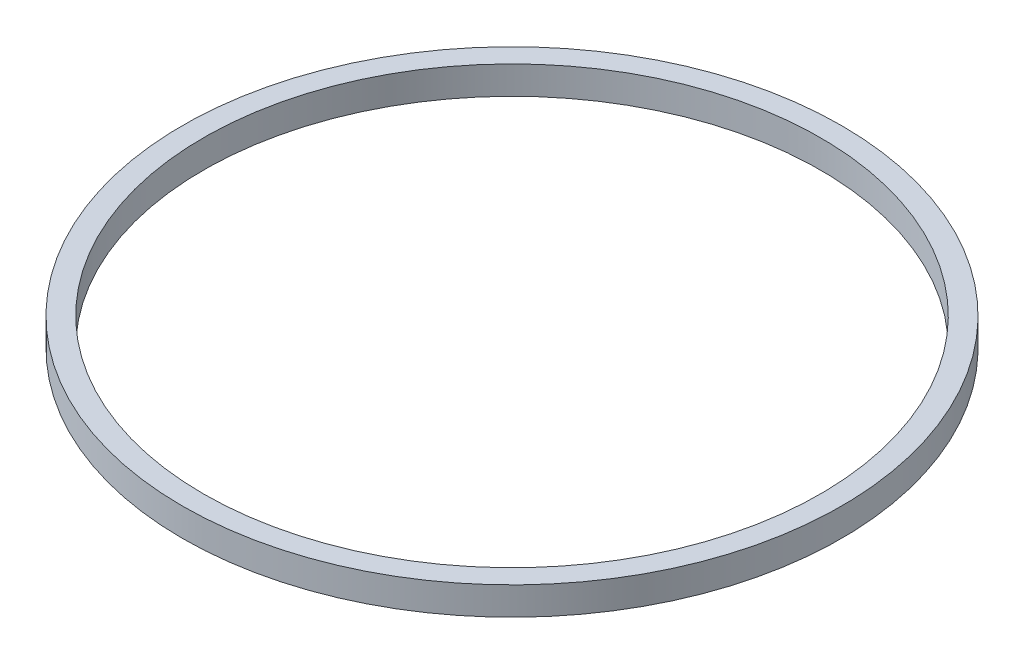
ISO-10303-21;
HEADER;
FILE_DESCRIPTION(('STEP AP214'),'2;1');
FILE_NAME('part.step','',(''),(''),'','','');
FILE_SCHEMA(('AUTOMOTIVE_DESIGN { 1 0 10303 214 1 1 1 1 }'));
ENDSEC;
DATA;
#1=APPLICATION_CONTEXT('core data for automotive mechanical design processes');
#2=APPLICATION_PROTOCOL_DEFINITION('international standard','automotive_design',2000,#1);
#3=PRODUCT_CONTEXT('',#1,'mechanical');
#4=PRODUCT('Part','Part','',(#3));
#5=PRODUCT_RELATED_PRODUCT_CATEGORY('part','',(#4));
#6=PRODUCT_DEFINITION_FORMATION('','',#4);
#7=PRODUCT_DEFINITION_CONTEXT('part definition',#1,'design');
#8=PRODUCT_DEFINITION('design','',#6,#7);
#9=PRODUCT_DEFINITION_SHAPE('','',#8);
#10=(LENGTH_UNIT() NAMED_UNIT(*) SI_UNIT(.MILLI.,.METRE.));
#11=(NAMED_UNIT(*) PLANE_ANGLE_UNIT() SI_UNIT($,.RADIAN.));
#12=(NAMED_UNIT(*) SI_UNIT($,.STERADIAN.) SOLID_ANGLE_UNIT());
#13=UNCERTAINTY_MEASURE_WITH_UNIT(LENGTH_MEASURE(1.E-05),#10,'distance_accuracy_value','');
#14=(GEOMETRIC_REPRESENTATION_CONTEXT(3) GLOBAL_UNCERTAINTY_ASSIGNED_CONTEXT((#13)) GLOBAL_UNIT_ASSIGNED_CONTEXT((#10,
#11,#12)) REPRESENTATION_CONTEXT('',''));
#15=CARTESIAN_POINT('',(0.,0.,0.));
#16=DIRECTION('',(0.,0.,1.));
#17=DIRECTION('',(1.,0.,0.));
#18=AXIS2_PLACEMENT_3D('',#15,#16,#17);
#19=CARTESIAN_POINT('',(0.,1.,0.));
#20=DIRECTION('',(0.,1.,0.));
#21=DIRECTION('',(0.,0.,1.));
#22=AXIS2_PLACEMENT_3D('',#19,#20,#21);
#23=PLANE('',#22);
#24=CARTESIAN_POINT('',(0.,1.,0.));
#25=DIRECTION('',(0.,1.,0.));
#26=DIRECTION('',(0.,0.,1.));
#27=AXIS2_PLACEMENT_3D('',#24,#25,#26);
#28=CIRCLE('',#27,11.75);
#29=CARTESIAN_POINT('',(0.,1.,11.75));
#30=VERTEX_POINT('',#29);
#31=EDGE_CURVE('E10',#30,#30,#28,.T.);
#32=ORIENTED_EDGE('',*,*,#31,.T.);
#33=EDGE_LOOP('',(#32));
#34=FACE_BOUND('',#33,.T.);
#35=CARTESIAN_POINT('',(0.,1.,0.));
#36=DIRECTION('',(0.,1.,0.));
#37=DIRECTION('',(0.,0.,1.));
#38=AXIS2_PLACEMENT_3D('',#35,#36,#37);
#39=CIRCLE('',#38,11.);
#40=CARTESIAN_POINT('',(0.,1.,11.));
#41=VERTEX_POINT('',#40);
#42=EDGE_CURVE('E50',#41,#41,#39,.T.);
#43=ORIENTED_EDGE('',*,*,#42,.F.);
#44=EDGE_LOOP('',(#43));
#45=FACE_BOUND('',#44,.T.);
#46=ADVANCED_FACE('F37',(#34,#45),#23,.T.);
#47=CARTESIAN_POINT('',(0.,0.,0.));
#48=DIRECTION('',(0.,1.,0.));
#49=DIRECTION('',(0.,0.,1.));
#50=AXIS2_PLACEMENT_3D('',#47,#48,#49);
#51=PLANE('',#50);
#52=CARTESIAN_POINT('',(0.,0.,0.));
#53=DIRECTION('',(0.,1.,0.));
#54=DIRECTION('',(0.,0.,1.));
#55=AXIS2_PLACEMENT_3D('',#52,#53,#54);
#56=CIRCLE('',#55,11.75);
#57=CARTESIAN_POINT('',(0.,0.,11.75));
#58=VERTEX_POINT('',#57);
#59=EDGE_CURVE('E41',#58,#58,#56,.T.);
#60=ORIENTED_EDGE('',*,*,#59,.F.);
#61=EDGE_LOOP('',(#60));
#62=FACE_BOUND('',#61,.T.);
#63=CARTESIAN_POINT('',(0.,0.,0.));
#64=DIRECTION('',(0.,1.,0.));
#65=DIRECTION('',(0.,0.,1.));
#66=AXIS2_PLACEMENT_3D('',#63,#64,#65);
#67=CIRCLE('',#66,11.);
#68=CARTESIAN_POINT('',(0.,0.,11.));
#69=VERTEX_POINT('',#68);
#70=EDGE_CURVE('E52',#69,#69,#67,.T.);
#71=ORIENTED_EDGE('',*,*,#70,.T.);
#72=EDGE_LOOP('',(#71));
#73=FACE_BOUND('',#72,.T.);
#74=ADVANCED_FACE('F64',(#62,#73),#51,.F.);
#75=CARTESIAN_POINT('',(0.,1.,0.));
#76=DIRECTION('',(0.,-1.,0.));
#77=DIRECTION('',(0.,0.,-1.));
#78=AXIS2_PLACEMENT_3D('',#75,#76,#77);
#79=CYLINDRICAL_SURFACE('',#78,11.75);
#80=ORIENTED_EDGE('',*,*,#31,.F.);
#81=EDGE_LOOP('',(#80));
#82=FACE_BOUND('',#81,.T.);
#83=ORIENTED_EDGE('',*,*,#59,.T.);
#84=EDGE_LOOP('',(#83));
#85=FACE_BOUND('',#84,.T.);
#86=ADVANCED_FACE('F39',(#82,#85),#79,.T.);
#87=CARTESIAN_POINT('',(0.,1.,0.));
#88=DIRECTION('',(0.,-1.,0.));
#89=DIRECTION('',(0.,0.,-1.));
#90=AXIS2_PLACEMENT_3D('',#87,#88,#89);
#91=CYLINDRICAL_SURFACE('',#90,11.);
#92=ORIENTED_EDGE('',*,*,#42,.T.);
#93=EDGE_LOOP('',(#92));
#94=FACE_BOUND('',#93,.T.);
#95=ORIENTED_EDGE('',*,*,#70,.F.);
#96=EDGE_LOOP('',(#95));
#97=FACE_BOUND('',#96,.T.);
#98=ADVANCED_FACE('F60',(#94,#97),#91,.F.);
#99=CLOSED_SHELL('',(#46,#74,#86,#98));
#100=MANIFOLD_SOLID_BREP('B2',#99);
#101=ADVANCED_BREP_SHAPE_REPRESENTATION('',(#18,#100),#14);
#102=SHAPE_DEFINITION_REPRESENTATION(#9,#101);
ENDSEC;
END-ISO-10303-21;
